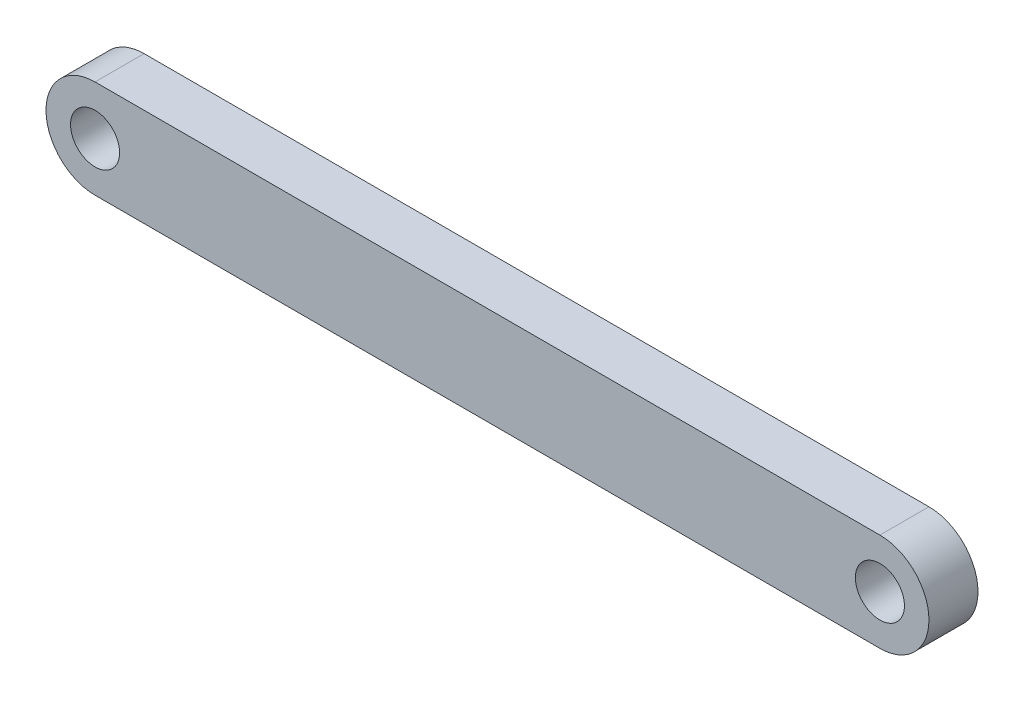
ISO-10303-21;
HEADER;
FILE_DESCRIPTION(('STEP AP214'),'2;1');
FILE_NAME('part.step','',(''),(''),'','','');
FILE_SCHEMA(('AUTOMOTIVE_DESIGN { 1 0 10303 214 1 1 1 1 }'));
ENDSEC;
DATA;
#1=APPLICATION_CONTEXT('core data for automotive mechanical design processes');
#2=APPLICATION_PROTOCOL_DEFINITION('international standard','automotive_design',2000,#1);
#3=PRODUCT_CONTEXT('',#1,'mechanical');
#4=PRODUCT('Part','Part','',(#3));
#5=PRODUCT_RELATED_PRODUCT_CATEGORY('part','',(#4));
#6=PRODUCT_DEFINITION_FORMATION('','',#4);
#7=PRODUCT_DEFINITION_CONTEXT('part definition',#1,'design');
#8=PRODUCT_DEFINITION('design','',#6,#7);
#9=PRODUCT_DEFINITION_SHAPE('','',#8);
#10=(LENGTH_UNIT() NAMED_UNIT(*) SI_UNIT(.MILLI.,.METRE.));
#11=(NAMED_UNIT(*) PLANE_ANGLE_UNIT() SI_UNIT($,.RADIAN.));
#12=(NAMED_UNIT(*) SI_UNIT($,.STERADIAN.) SOLID_ANGLE_UNIT());
#13=UNCERTAINTY_MEASURE_WITH_UNIT(LENGTH_MEASURE(1.E-05),#10,'distance_accuracy_value','');
#14=(GEOMETRIC_REPRESENTATION_CONTEXT(3) GLOBAL_UNCERTAINTY_ASSIGNED_CONTEXT((#13)) GLOBAL_UNIT_ASSIGNED_CONTEXT((#10,
#11,#12)) REPRESENTATION_CONTEXT('',''));
#15=CARTESIAN_POINT('',(0.,0.,0.));
#16=DIRECTION('',(0.,0.,1.));
#17=DIRECTION('',(1.,0.,0.));
#18=AXIS2_PLACEMENT_3D('',#15,#16,#17);
#19=CARTESIAN_POINT('',(-54.1194025136374,-3.70442934619528,10.));
#20=DIRECTION('',(0.,0.,-1.));
#21=DIRECTION('',(-1.,0.,0.));
#22=AXIS2_PLACEMENT_3D('',#19,#20,#21);
#23=CYLINDRICAL_SURFACE('',#22,10.);
#24=CARTESIAN_POINT('',(-54.1194025136374,-3.70442934619528,0.));
#25=DIRECTION('',(0.,0.,1.));
#26=DIRECTION('',(1.,0.,0.));
#27=AXIS2_PLACEMENT_3D('',#24,#25,#26);
#28=CIRCLE('',#27,10.);
#29=CARTESIAN_POINT('',(-54.1194025136374,6.29557065380472,0.));
#30=VERTEX_POINT('',#29);
#31=CARTESIAN_POINT('',(-54.1194025136374,-13.7044293461953,0.));
#32=VERTEX_POINT('',#31);
#33=EDGE_CURVE('E102',#30,#32,#28,.T.);
#34=ORIENTED_EDGE('',*,*,#33,.T.);
#35=DIRECTION('',(0.,0.,-1.));
#36=VECTOR('',#35,1.);
#37=CARTESIAN_POINT('',(-54.1194025136374,-13.7044293461953,10.));
#38=LINE('',#37,#36);
#39=CARTESIAN_POINT('',(-54.1194025136374,-13.7044293461953,10.));
#40=VERTEX_POINT('',#39);
#41=EDGE_CURVE('E11',#40,#32,#38,.T.);
#42=ORIENTED_EDGE('',*,*,#41,.F.);
#43=CARTESIAN_POINT('',(-54.1194025136374,-3.70442934619528,10.));
#44=DIRECTION('',(0.,0.,1.));
#45=DIRECTION('',(1.,0.,0.));
#46=AXIS2_PLACEMENT_3D('',#43,#44,#45);
#47=CIRCLE('',#46,10.);
#48=CARTESIAN_POINT('',(-54.1194025136374,6.29557065380472,10.));
#49=VERTEX_POINT('',#48);
#50=EDGE_CURVE('E90',#49,#40,#47,.T.);
#51=ORIENTED_EDGE('',*,*,#50,.F.);
#52=DIRECTION('',(0.,0.,-1.));
#53=VECTOR('',#52,1.);
#54=CARTESIAN_POINT('',(-54.1194025136374,6.29557065380472,10.));
#55=LINE('',#54,#53);
#56=EDGE_CURVE('E98',#49,#30,#55,.T.);
#57=ORIENTED_EDGE('',*,*,#56,.T.);
#58=EDGE_LOOP('',(#34,#42,#51,#57));
#59=FACE_BOUND('',#58,.T.);
#60=ADVANCED_FACE('F39',(#59),#23,.T.);
#61=CARTESIAN_POINT('',(-54.1194025136374,-13.7044293461953,10.));
#62=DIRECTION('',(0.,1.,0.));
#63=DIRECTION('',(0.,0.,1.));
#64=AXIS2_PLACEMENT_3D('',#61,#62,#63);
#65=PLANE('',#64);
#66=DIRECTION('',(1.,0.,0.));
#67=VECTOR('',#66,1.);
#68=CARTESIAN_POINT('',(-54.1194025136374,-13.7044293461953,0.));
#69=LINE('',#68,#67);
#70=CARTESIAN_POINT('',(105.880597486363,-13.7044293461953,0.));
#71=VERTEX_POINT('',#70);
#72=EDGE_CURVE('E94',#32,#71,#69,.T.);
#73=ORIENTED_EDGE('',*,*,#72,.T.);
#74=DIRECTION('',(0.,0.,-1.));
#75=VECTOR('',#74,1.);
#76=CARTESIAN_POINT('',(105.880597486363,-13.7044293461953,10.));
#77=LINE('',#76,#75);
#78=CARTESIAN_POINT('',(105.880597486363,-13.7044293461953,10.));
#79=VERTEX_POINT('',#78);
#80=EDGE_CURVE('E47',#79,#71,#77,.T.);
#81=ORIENTED_EDGE('',*,*,#80,.F.);
#82=DIRECTION('',(1.,0.,0.));
#83=VECTOR('',#82,1.);
#84=CARTESIAN_POINT('',(-54.1194025136374,-13.7044293461953,10.));
#85=LINE('',#84,#83);
#86=EDGE_CURVE('E85',#40,#79,#85,.T.);
#87=ORIENTED_EDGE('',*,*,#86,.F.);
#88=ORIENTED_EDGE('',*,*,#41,.T.);
#89=EDGE_LOOP('',(#73,#81,#87,#88));
#90=FACE_BOUND('',#89,.T.);
#91=ADVANCED_FACE('F93',(#90),#65,.F.);
#92=CARTESIAN_POINT('',(105.880597486363,-3.70442934619528,10.));
#93=DIRECTION('',(0.,0.,-1.));
#94=DIRECTION('',(-1.,0.,0.));
#95=AXIS2_PLACEMENT_3D('',#92,#93,#94);
#96=CYLINDRICAL_SURFACE('',#95,10.);
#97=CARTESIAN_POINT('',(105.880597486363,-3.70442934619528,0.));
#98=DIRECTION('',(0.,0.,1.));
#99=DIRECTION('',(-1.,0.,0.));
#100=AXIS2_PLACEMENT_3D('',#97,#98,#99);
#101=CIRCLE('',#100,10.);
#102=CARTESIAN_POINT('',(105.880597486363,6.29557065380472,0.));
#103=VERTEX_POINT('',#102);
#104=EDGE_CURVE('E72',#71,#103,#101,.T.);
#105=ORIENTED_EDGE('',*,*,#104,.T.);
#106=DIRECTION('',(0.,0.,-1.));
#107=VECTOR('',#106,1.);
#108=CARTESIAN_POINT('',(105.880597486363,6.29557065380472,10.));
#109=LINE('',#108,#107);
#110=CARTESIAN_POINT('',(105.880597486363,6.29557065380472,10.));
#111=VERTEX_POINT('',#110);
#112=EDGE_CURVE('E95',#111,#103,#109,.T.);
#113=ORIENTED_EDGE('',*,*,#112,.F.);
#114=CARTESIAN_POINT('',(105.880597486363,-3.70442934619528,10.));
#115=DIRECTION('',(0.,0.,1.));
#116=DIRECTION('',(-1.,0.,0.));
#117=AXIS2_PLACEMENT_3D('',#114,#115,#116);
#118=CIRCLE('',#117,10.);
#119=EDGE_CURVE('E88',#79,#111,#118,.T.);
#120=ORIENTED_EDGE('',*,*,#119,.F.);
#121=ORIENTED_EDGE('',*,*,#80,.T.);
#122=EDGE_LOOP('',(#105,#113,#120,#121));
#123=FACE_BOUND('',#122,.T.);
#124=ADVANCED_FACE('F96',(#123),#96,.T.);
#125=CARTESIAN_POINT('',(-54.1194025136374,6.29557065380472,10.));
#126=DIRECTION('',(0.,-1.,0.));
#127=DIRECTION('',(0.,0.,-1.));
#128=AXIS2_PLACEMENT_3D('',#125,#126,#127);
#129=PLANE('',#128);
#130=DIRECTION('',(-1.,0.,0.));
#131=VECTOR('',#130,1.);
#132=CARTESIAN_POINT('',(-54.1194025136374,6.29557065380472,0.));
#133=LINE('',#132,#131);
#134=EDGE_CURVE('E78',#103,#30,#133,.T.);
#135=ORIENTED_EDGE('',*,*,#134,.T.);
#136=ORIENTED_EDGE('',*,*,#56,.F.);
#137=DIRECTION('',(-1.,0.,0.));
#138=VECTOR('',#137,1.);
#139=CARTESIAN_POINT('',(-54.1194025136374,6.29557065380472,10.));
#140=LINE('',#139,#138);
#141=EDGE_CURVE('E55',#111,#49,#140,.T.);
#142=ORIENTED_EDGE('',*,*,#141,.F.);
#143=ORIENTED_EDGE('',*,*,#112,.T.);
#144=EDGE_LOOP('',(#135,#136,#142,#143));
#145=FACE_BOUND('',#144,.T.);
#146=ADVANCED_FACE('F110',(#145),#129,.F.);
#147=CARTESIAN_POINT('',(-54.1194025136374,-3.70442934619528,10.));
#148=DIRECTION('',(0.,0.,1.));
#149=DIRECTION('',(1.,0.,0.));
#150=AXIS2_PLACEMENT_3D('',#147,#148,#149);
#151=PLANE('',#150);
#152=CARTESIAN_POINT('',(105.880597486363,-3.70442934619528,10.));
#153=DIRECTION('',(0.,0.,1.));
#154=DIRECTION('',(1.,0.,0.));
#155=AXIS2_PLACEMENT_3D('',#152,#153,#154);
#156=CIRCLE('',#155,5.);
#157=CARTESIAN_POINT('',(110.880597486363,-3.70442934619528,10.));
#158=VERTEX_POINT('',#157);
#159=EDGE_CURVE('E122',#158,#158,#156,.T.);
#160=ORIENTED_EDGE('',*,*,#159,.F.);
#161=EDGE_LOOP('',(#160));
#162=FACE_BOUND('',#161,.T.);
#163=CARTESIAN_POINT('',(-54.1194025136374,-3.70442934619528,10.));
#164=DIRECTION('',(0.,0.,1.));
#165=DIRECTION('',(1.,0.,0.));
#166=AXIS2_PLACEMENT_3D('',#163,#164,#165);
#167=CIRCLE('',#166,5.);
#168=CARTESIAN_POINT('',(-49.1194025136374,-3.70442934619528,10.));
#169=VERTEX_POINT('',#168);
#170=EDGE_CURVE('E119',#169,#169,#167,.T.);
#171=ORIENTED_EDGE('',*,*,#170,.F.);
#172=EDGE_LOOP('',(#171));
#173=FACE_BOUND('',#172,.T.);
#174=ORIENTED_EDGE('',*,*,#50,.T.);
#175=ORIENTED_EDGE('',*,*,#86,.T.);
#176=ORIENTED_EDGE('',*,*,#119,.T.);
#177=ORIENTED_EDGE('',*,*,#141,.T.);
#178=EDGE_LOOP('',(#174,#175,#176,#177));
#179=FACE_BOUND('',#178,.T.);
#180=ADVANCED_FACE('F86',(#162,#173,#179),#151,.T.);
#181=CARTESIAN_POINT('',(-54.1194025136374,-3.70442934619528,0.));
#182=DIRECTION('',(0.,0.,1.));
#183=DIRECTION('',(1.,0.,0.));
#184=AXIS2_PLACEMENT_3D('',#181,#182,#183);
#185=PLANE('',#184);
#186=CARTESIAN_POINT('',(105.880597486363,-3.70442934619528,0.));
#187=DIRECTION('',(0.,0.,1.));
#188=DIRECTION('',(1.,0.,0.));
#189=AXIS2_PLACEMENT_3D('',#186,#187,#188);
#190=CIRCLE('',#189,5.);
#191=CARTESIAN_POINT('',(110.880597486363,-3.70442934619528,0.));
#192=VERTEX_POINT('',#191);
#193=EDGE_CURVE('E105',#192,#192,#190,.T.);
#194=ORIENTED_EDGE('',*,*,#193,.T.);
#195=EDGE_LOOP('',(#194));
#196=FACE_BOUND('',#195,.T.);
#197=CARTESIAN_POINT('',(-54.1194025136374,-3.70442934619528,0.));
#198=DIRECTION('',(0.,0.,1.));
#199=DIRECTION('',(1.,0.,0.));
#200=AXIS2_PLACEMENT_3D('',#197,#198,#199);
#201=CIRCLE('',#200,5.);
#202=CARTESIAN_POINT('',(-49.1194025136374,-3.70442934619528,0.));
#203=VERTEX_POINT('',#202);
#204=EDGE_CURVE('E116',#203,#203,#201,.T.);
#205=ORIENTED_EDGE('',*,*,#204,.T.);
#206=EDGE_LOOP('',(#205));
#207=FACE_BOUND('',#206,.T.);
#208=ORIENTED_EDGE('',*,*,#33,.F.);
#209=ORIENTED_EDGE('',*,*,#134,.F.);
#210=ORIENTED_EDGE('',*,*,#104,.F.);
#211=ORIENTED_EDGE('',*,*,#72,.F.);
#212=EDGE_LOOP('',(#208,#209,#210,#211));
#213=FACE_BOUND('',#212,.T.);
#214=ADVANCED_FACE('F113',(#196,#207,#213),#185,.F.);
#215=CARTESIAN_POINT('',(-54.1194025136374,-3.70442934619528,0.));
#216=DIRECTION('',(0.,0.,1.));
#217=DIRECTION('',(1.,0.,0.));
#218=AXIS2_PLACEMENT_3D('',#215,#216,#217);
#219=CYLINDRICAL_SURFACE('',#218,5.);
#220=ORIENTED_EDGE('',*,*,#204,.F.);
#221=EDGE_LOOP('',(#220));
#222=FACE_BOUND('',#221,.T.);
#223=ORIENTED_EDGE('',*,*,#170,.T.);
#224=EDGE_LOOP('',(#223));
#225=FACE_BOUND('',#224,.T.);
#226=ADVANCED_FACE('F133',(#222,#225),#219,.F.);
#227=CARTESIAN_POINT('',(105.880597486363,-3.70442934619528,0.));
#228=DIRECTION('',(0.,0.,1.));
#229=DIRECTION('',(1.,0.,0.));
#230=AXIS2_PLACEMENT_3D('',#227,#228,#229);
#231=CYLINDRICAL_SURFACE('',#230,5.);
#232=ORIENTED_EDGE('',*,*,#193,.F.);
#233=EDGE_LOOP('',(#232));
#234=FACE_BOUND('',#233,.T.);
#235=ORIENTED_EDGE('',*,*,#159,.T.);
#236=EDGE_LOOP('',(#235));
#237=FACE_BOUND('',#236,.T.);
#238=ADVANCED_FACE('F130',(#234,#237),#231,.F.);
#239=CLOSED_SHELL('',(#60,#91,#124,#146,#180,#214,#226,#238));
#240=MANIFOLD_SOLID_BREP('B2',#239);
#241=ADVANCED_BREP_SHAPE_REPRESENTATION('',(#18,#240),#14);
#242=SHAPE_DEFINITION_REPRESENTATION(#9,#241);
ENDSEC;
END-ISO-10303-21;
